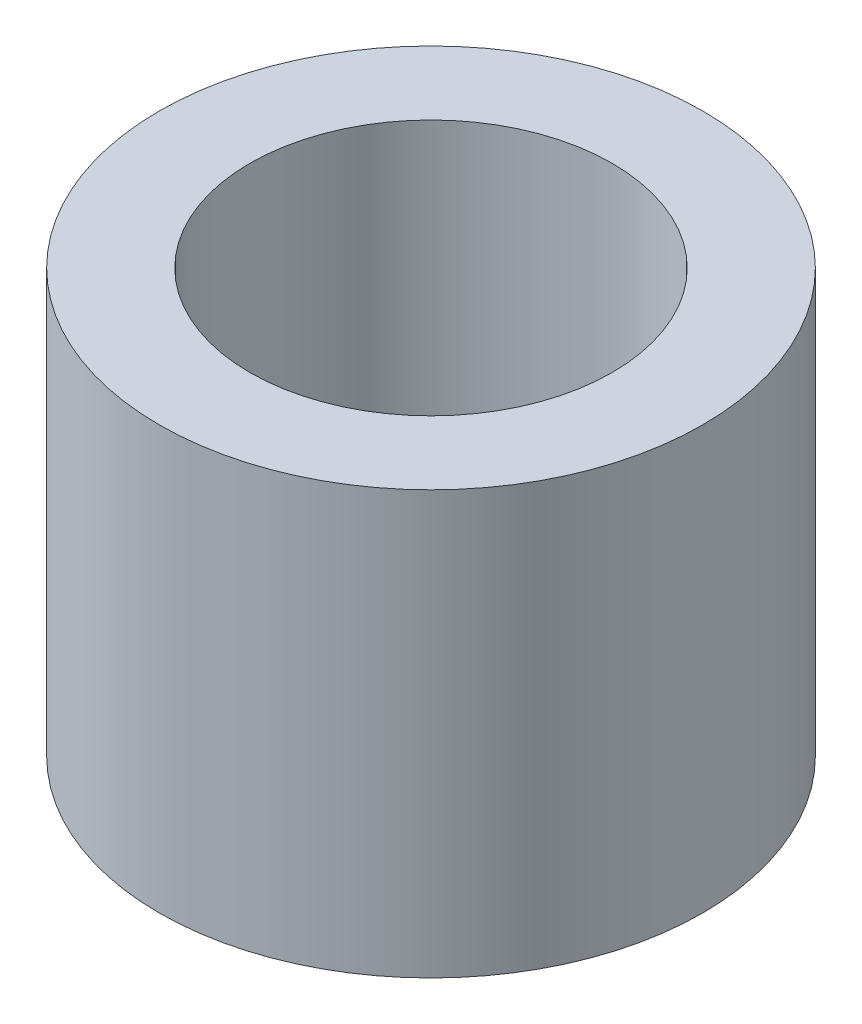
ISO-10303-21;
HEADER;
FILE_DESCRIPTION(('STEP AP214'),'2;1');
FILE_NAME('part.step','',(''),(''),'','','');
FILE_SCHEMA(('AUTOMOTIVE_DESIGN { 1 0 10303 214 1 1 1 1 }'));
ENDSEC;
DATA;
#1=APPLICATION_CONTEXT('core data for automotive mechanical design processes');
#2=APPLICATION_PROTOCOL_DEFINITION('international standard','automotive_design',2000,#1);
#3=PRODUCT_CONTEXT('',#1,'mechanical');
#4=PRODUCT('Part','Part','',(#3));
#5=PRODUCT_RELATED_PRODUCT_CATEGORY('part','',(#4));
#6=PRODUCT_DEFINITION_FORMATION('','',#4);
#7=PRODUCT_DEFINITION_CONTEXT('part definition',#1,'design');
#8=PRODUCT_DEFINITION('design','',#6,#7);
#9=PRODUCT_DEFINITION_SHAPE('','',#8);
#10=(LENGTH_UNIT() NAMED_UNIT(*) SI_UNIT(.MILLI.,.METRE.));
#11=(NAMED_UNIT(*) PLANE_ANGLE_UNIT() SI_UNIT($,.RADIAN.));
#12=(NAMED_UNIT(*) SI_UNIT($,.STERADIAN.) SOLID_ANGLE_UNIT());
#13=UNCERTAINTY_MEASURE_WITH_UNIT(LENGTH_MEASURE(1.E-05),#10,'distance_accuracy_value','');
#14=(GEOMETRIC_REPRESENTATION_CONTEXT(3) GLOBAL_UNCERTAINTY_ASSIGNED_CONTEXT((#13)) GLOBAL_UNIT_ASSIGNED_CONTEXT((#10,
#11,#12)) REPRESENTATION_CONTEXT('',''));
#15=CARTESIAN_POINT('',(0.,0.,0.));
#16=DIRECTION('',(0.,0.,1.));
#17=DIRECTION('',(1.,0.,0.));
#18=AXIS2_PLACEMENT_3D('',#15,#16,#17);
#19=CARTESIAN_POINT('',(0.,15.5078004074712,0.));
#20=DIRECTION('',(0.,1.,0.));
#21=DIRECTION('',(0.,0.,1.));
#22=AXIS2_PLACEMENT_3D('',#19,#20,#21);
#23=CYLINDRICAL_SURFACE('',#22,6.);
#24=CARTESIAN_POINT('',(0.,6.99999999999999,0.));
#25=DIRECTION('',(0.,1.,0.));
#26=DIRECTION('',(0.,0.,1.));
#27=AXIS2_PLACEMENT_3D('',#24,#25,#26);
#28=CIRCLE('',#27,6.);
#29=CARTESIAN_POINT('',(0.,6.99999999999999,6.));
#30=VERTEX_POINT('',#29);
#31=EDGE_CURVE('E10',#30,#30,#28,.T.);
#32=ORIENTED_EDGE('',*,*,#31,.T.);
#33=EDGE_LOOP('',(#32));
#34=FACE_BOUND('',#33,.T.);
#35=CARTESIAN_POINT('',(0.,-7.,0.));
#36=DIRECTION('',(0.,1.,0.));
#37=DIRECTION('',(0.,0.,1.));
#38=AXIS2_PLACEMENT_3D('',#35,#36,#37);
#39=CIRCLE('',#38,6.);
#40=CARTESIAN_POINT('',(0.,-7.,6.));
#41=VERTEX_POINT('',#40);
#42=EDGE_CURVE('E53',#41,#41,#39,.T.);
#43=ORIENTED_EDGE('',*,*,#42,.F.);
#44=EDGE_LOOP('',(#43));
#45=FACE_BOUND('',#44,.T.);
#46=ADVANCED_FACE('F36',(#34,#45),#23,.F.);
#47=CARTESIAN_POINT('',(0.,6.99999999999999,9.));
#48=DIRECTION('',(0.,1.,0.));
#49=DIRECTION('',(0.,0.,1.));
#50=AXIS2_PLACEMENT_3D('',#47,#48,#49);
#51=PLANE('',#50);
#52=CARTESIAN_POINT('',(0.,6.99999999999999,0.));
#53=DIRECTION('',(0.,1.,0.));
#54=DIRECTION('',(0.,0.,1.));
#55=AXIS2_PLACEMENT_3D('',#52,#53,#54);
#56=CIRCLE('',#55,9.);
#57=CARTESIAN_POINT('',(0.,6.99999999999999,9.));
#58=VERTEX_POINT('',#57);
#59=EDGE_CURVE('E43',#58,#58,#56,.T.);
#60=ORIENTED_EDGE('',*,*,#59,.T.);
#61=EDGE_LOOP('',(#60));
#62=FACE_BOUND('',#61,.T.);
#63=ORIENTED_EDGE('',*,*,#31,.F.);
#64=EDGE_LOOP('',(#63));
#65=FACE_BOUND('',#64,.T.);
#66=ADVANCED_FACE('F64',(#62,#65),#51,.T.);
#67=CARTESIAN_POINT('',(0.,15.5078004074712,0.));
#68=DIRECTION('',(0.,1.,0.));
#69=DIRECTION('',(0.,0.,1.));
#70=AXIS2_PLACEMENT_3D('',#67,#68,#69);
#71=CYLINDRICAL_SURFACE('',#70,9.);
#72=CARTESIAN_POINT('',(0.,-7.,0.));
#73=DIRECTION('',(0.,1.,0.));
#74=DIRECTION('',(0.,0.,1.));
#75=AXIS2_PLACEMENT_3D('',#72,#73,#74);
#76=CIRCLE('',#75,9.);
#77=CARTESIAN_POINT('',(0.,-7.,9.));
#78=VERTEX_POINT('',#77);
#79=EDGE_CURVE('E48',#78,#78,#76,.T.);
#80=ORIENTED_EDGE('',*,*,#79,.T.);
#81=EDGE_LOOP('',(#80));
#82=FACE_BOUND('',#81,.T.);
#83=ORIENTED_EDGE('',*,*,#59,.F.);
#84=EDGE_LOOP('',(#83));
#85=FACE_BOUND('',#84,.T.);
#86=ADVANCED_FACE('F68',(#82,#85),#71,.T.);
#87=CARTESIAN_POINT('',(0.,-7.00000000000001,9.));
#88=DIRECTION('',(0.,-1.,0.));
#89=DIRECTION('',(0.,0.,-1.));
#90=AXIS2_PLACEMENT_3D('',#87,#88,#89);
#91=PLANE('',#90);
#92=ORIENTED_EDGE('',*,*,#42,.T.);
#93=EDGE_LOOP('',(#92));
#94=FACE_BOUND('',#93,.T.);
#95=ORIENTED_EDGE('',*,*,#79,.F.);
#96=EDGE_LOOP('',(#95));
#97=FACE_BOUND('',#96,.T.);
#98=ADVANCED_FACE('F60',(#94,#97),#91,.T.);
#99=CLOSED_SHELL('',(#46,#66,#86,#98));
#100=MANIFOLD_SOLID_BREP('B2',#99);
#101=ADVANCED_BREP_SHAPE_REPRESENTATION('',(#18,#100),#14);
#102=SHAPE_DEFINITION_REPRESENTATION(#9,#101);
ENDSEC;
END-ISO-10303-21;
